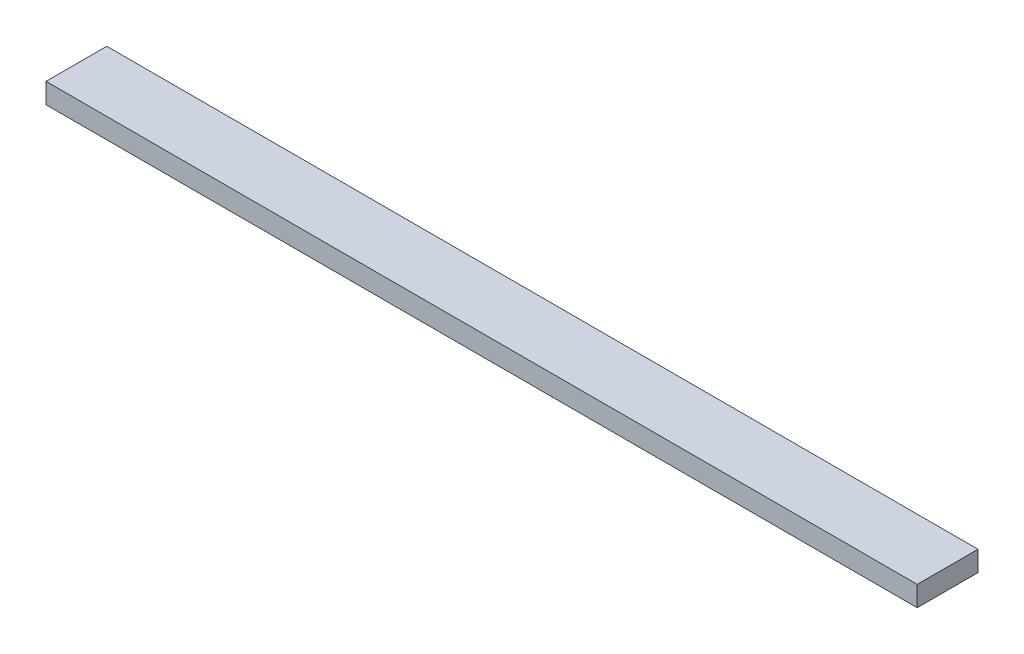
ISO-10303-21;
HEADER;
FILE_DESCRIPTION(('STEP AP214'),'2;1');
FILE_NAME('part.step','',(''),(''),'','','');
FILE_SCHEMA(('AUTOMOTIVE_DESIGN { 1 0 10303 214 1 1 1 1 }'));
ENDSEC;
DATA;
#1=APPLICATION_CONTEXT('core data for automotive mechanical design processes');
#2=APPLICATION_PROTOCOL_DEFINITION('international standard','automotive_design',2000,#1);
#3=PRODUCT_CONTEXT('',#1,'mechanical');
#4=PRODUCT('Part','Part','',(#3));
#5=PRODUCT_RELATED_PRODUCT_CATEGORY('part','',(#4));
#6=PRODUCT_DEFINITION_FORMATION('','',#4);
#7=PRODUCT_DEFINITION_CONTEXT('part definition',#1,'design');
#8=PRODUCT_DEFINITION('design','',#6,#7);
#9=PRODUCT_DEFINITION_SHAPE('','',#8);
#10=(LENGTH_UNIT() NAMED_UNIT(*) SI_UNIT(.MILLI.,.METRE.));
#11=(NAMED_UNIT(*) PLANE_ANGLE_UNIT() SI_UNIT($,.RADIAN.));
#12=(NAMED_UNIT(*) SI_UNIT($,.STERADIAN.) SOLID_ANGLE_UNIT());
#13=UNCERTAINTY_MEASURE_WITH_UNIT(LENGTH_MEASURE(1.E-05),#10,'distance_accuracy_value','');
#14=(GEOMETRIC_REPRESENTATION_CONTEXT(3) GLOBAL_UNCERTAINTY_ASSIGNED_CONTEXT((#13)) GLOBAL_UNIT_ASSIGNED_CONTEXT((#10,
#11,#12)) REPRESENTATION_CONTEXT('',''));
#15=CARTESIAN_POINT('',(0.,0.,0.));
#16=DIRECTION('',(0.,0.,1.));
#17=DIRECTION('',(1.,0.,0.));
#18=AXIS2_PLACEMENT_3D('',#15,#16,#17);
#19=CARTESIAN_POINT('',(0.,12.7,0.));
#20=DIRECTION('',(1.,0.,0.));
#21=DIRECTION('',(0.,0.,-1.));
#22=AXIS2_PLACEMENT_3D('',#19,#20,#21);
#23=PLANE('',#22);
#24=DIRECTION('',(0.,0.,1.));
#25=VECTOR('',#24,1.);
#26=CARTESIAN_POINT('',(0.,0.,0.));
#27=LINE('',#26,#25);
#28=CARTESIAN_POINT('',(0.,0.,-38.1));
#29=VERTEX_POINT('',#28);
#30=CARTESIAN_POINT('',(0.,0.,0.));
#31=VERTEX_POINT('',#30);
#32=EDGE_CURVE('E97',#29,#31,#27,.T.);
#33=ORIENTED_EDGE('',*,*,#32,.T.);
#34=DIRECTION('',(0.,-1.,0.));
#35=VECTOR('',#34,1.);
#36=CARTESIAN_POINT('',(0.,12.7,0.));
#37=LINE('',#36,#35);
#38=CARTESIAN_POINT('',(0.,12.7,0.));
#39=VERTEX_POINT('',#38);
#40=EDGE_CURVE('E11',#39,#31,#37,.T.);
#41=ORIENTED_EDGE('',*,*,#40,.F.);
#42=DIRECTION('',(0.,0.,1.));
#43=VECTOR('',#42,1.);
#44=CARTESIAN_POINT('',(0.,12.7,0.));
#45=LINE('',#44,#43);
#46=CARTESIAN_POINT('',(0.,12.7,-38.1));
#47=VERTEX_POINT('',#46);
#48=EDGE_CURVE('E85',#47,#39,#45,.T.);
#49=ORIENTED_EDGE('',*,*,#48,.F.);
#50=DIRECTION('',(0.,-1.,0.));
#51=VECTOR('',#50,1.);
#52=CARTESIAN_POINT('',(0.,12.7,-38.1));
#53=LINE('',#52,#51);
#54=EDGE_CURVE('E93',#47,#29,#53,.T.);
#55=ORIENTED_EDGE('',*,*,#54,.T.);
#56=EDGE_LOOP('',(#33,#41,#49,#55));
#57=FACE_BOUND('',#56,.T.);
#58=ADVANCED_FACE('F34',(#57),#23,.F.);
#59=CARTESIAN_POINT('',(0.,12.7,0.));
#60=DIRECTION('',(0.,0.,-1.));
#61=DIRECTION('',(-1.,0.,0.));
#62=AXIS2_PLACEMENT_3D('',#59,#60,#61);
#63=PLANE('',#62);
#64=DIRECTION('',(1.,0.,0.));
#65=VECTOR('',#64,1.);
#66=CARTESIAN_POINT('',(0.,0.,0.));
#67=LINE('',#66,#65);
#68=CARTESIAN_POINT('',(546.1,0.,0.));
#69=VERTEX_POINT('',#68);
#70=EDGE_CURVE('E89',#31,#69,#67,.T.);
#71=ORIENTED_EDGE('',*,*,#70,.T.);
#72=DIRECTION('',(0.,-1.,0.));
#73=VECTOR('',#72,1.);
#74=CARTESIAN_POINT('',(546.1,12.7,0.));
#75=LINE('',#74,#73);
#76=CARTESIAN_POINT('',(546.1,12.7,0.));
#77=VERTEX_POINT('',#76);
#78=EDGE_CURVE('E42',#77,#69,#75,.T.);
#79=ORIENTED_EDGE('',*,*,#78,.F.);
#80=DIRECTION('',(1.,0.,0.));
#81=VECTOR('',#80,1.);
#82=CARTESIAN_POINT('',(0.,12.7,0.));
#83=LINE('',#82,#81);
#84=EDGE_CURVE('E80',#39,#77,#83,.T.);
#85=ORIENTED_EDGE('',*,*,#84,.F.);
#86=ORIENTED_EDGE('',*,*,#40,.T.);
#87=EDGE_LOOP('',(#71,#79,#85,#86));
#88=FACE_BOUND('',#87,.T.);
#89=ADVANCED_FACE('F88',(#88),#63,.F.);
#90=CARTESIAN_POINT('',(546.1,12.7,0.));
#91=DIRECTION('',(-1.,0.,0.));
#92=DIRECTION('',(0.,0.,1.));
#93=AXIS2_PLACEMENT_3D('',#90,#91,#92);
#94=PLANE('',#93);
#95=DIRECTION('',(0.,0.,-1.));
#96=VECTOR('',#95,1.);
#97=CARTESIAN_POINT('',(546.1,0.,0.));
#98=LINE('',#97,#96);
#99=CARTESIAN_POINT('',(546.1,0.,-38.1));
#100=VERTEX_POINT('',#99);
#101=EDGE_CURVE('E67',#69,#100,#98,.T.);
#102=ORIENTED_EDGE('',*,*,#101,.T.);
#103=DIRECTION('',(0.,-1.,0.));
#104=VECTOR('',#103,1.);
#105=CARTESIAN_POINT('',(546.1,12.7,-38.1));
#106=LINE('',#105,#104);
#107=CARTESIAN_POINT('',(546.1,12.7,-38.1));
#108=VERTEX_POINT('',#107);
#109=EDGE_CURVE('E90',#108,#100,#106,.T.);
#110=ORIENTED_EDGE('',*,*,#109,.F.);
#111=DIRECTION('',(0.,0.,-1.));
#112=VECTOR('',#111,1.);
#113=CARTESIAN_POINT('',(546.1,12.7,0.));
#114=LINE('',#113,#112);
#115=EDGE_CURVE('E83',#77,#108,#114,.T.);
#116=ORIENTED_EDGE('',*,*,#115,.F.);
#117=ORIENTED_EDGE('',*,*,#78,.T.);
#118=EDGE_LOOP('',(#102,#110,#116,#117));
#119=FACE_BOUND('',#118,.T.);
#120=ADVANCED_FACE('F91',(#119),#94,.F.);
#121=CARTESIAN_POINT('',(0.,12.7,-38.1));
#122=DIRECTION('',(0.,0.,1.));
#123=DIRECTION('',(1.,0.,0.));
#124=AXIS2_PLACEMENT_3D('',#121,#122,#123);
#125=PLANE('',#124);
#126=DIRECTION('',(-1.,0.,0.));
#127=VECTOR('',#126,1.);
#128=CARTESIAN_POINT('',(0.,0.,-38.1));
#129=LINE('',#128,#127);
#130=EDGE_CURVE('E73',#100,#29,#129,.T.);
#131=ORIENTED_EDGE('',*,*,#130,.T.);
#132=ORIENTED_EDGE('',*,*,#54,.F.);
#133=DIRECTION('',(-1.,0.,0.));
#134=VECTOR('',#133,1.);
#135=CARTESIAN_POINT('',(0.,12.7,-38.1));
#136=LINE('',#135,#134);
#137=EDGE_CURVE('E50',#108,#47,#136,.T.);
#138=ORIENTED_EDGE('',*,*,#137,.F.);
#139=ORIENTED_EDGE('',*,*,#109,.T.);
#140=EDGE_LOOP('',(#131,#132,#138,#139));
#141=FACE_BOUND('',#140,.T.);
#142=ADVANCED_FACE('F104',(#141),#125,.F.);
#143=CARTESIAN_POINT('',(0.,12.7,0.));
#144=DIRECTION('',(0.,-1.,0.));
#145=DIRECTION('',(0.,0.,-1.));
#146=AXIS2_PLACEMENT_3D('',#143,#144,#145);
#147=PLANE('',#146);
#148=ORIENTED_EDGE('',*,*,#48,.T.);
#149=ORIENTED_EDGE('',*,*,#84,.T.);
#150=ORIENTED_EDGE('',*,*,#115,.T.);
#151=ORIENTED_EDGE('',*,*,#137,.T.);
#152=EDGE_LOOP('',(#148,#149,#150,#151));
#153=FACE_BOUND('',#152,.T.);
#154=ADVANCED_FACE('F81',(#153),#147,.F.);
#155=CARTESIAN_POINT('',(0.,0.,0.));
#156=DIRECTION('',(0.,-1.,0.));
#157=DIRECTION('',(0.,0.,-1.));
#158=AXIS2_PLACEMENT_3D('',#155,#156,#157);
#159=PLANE('',#158);
#160=ORIENTED_EDGE('',*,*,#32,.F.);
#161=ORIENTED_EDGE('',*,*,#130,.F.);
#162=ORIENTED_EDGE('',*,*,#101,.F.);
#163=ORIENTED_EDGE('',*,*,#70,.F.);
#164=EDGE_LOOP('',(#160,#161,#162,#163));
#165=FACE_BOUND('',#164,.T.);
#166=ADVANCED_FACE('F107',(#165),#159,.T.);
#167=CLOSED_SHELL('',(#58,#89,#120,#142,#154,#166));
#168=MANIFOLD_SOLID_BREP('B2',#167);
#169=ADVANCED_BREP_SHAPE_REPRESENTATION('',(#18,#168),#14);
#170=SHAPE_DEFINITION_REPRESENTATION(#9,#169);
ENDSEC;
END-ISO-10303-21;
